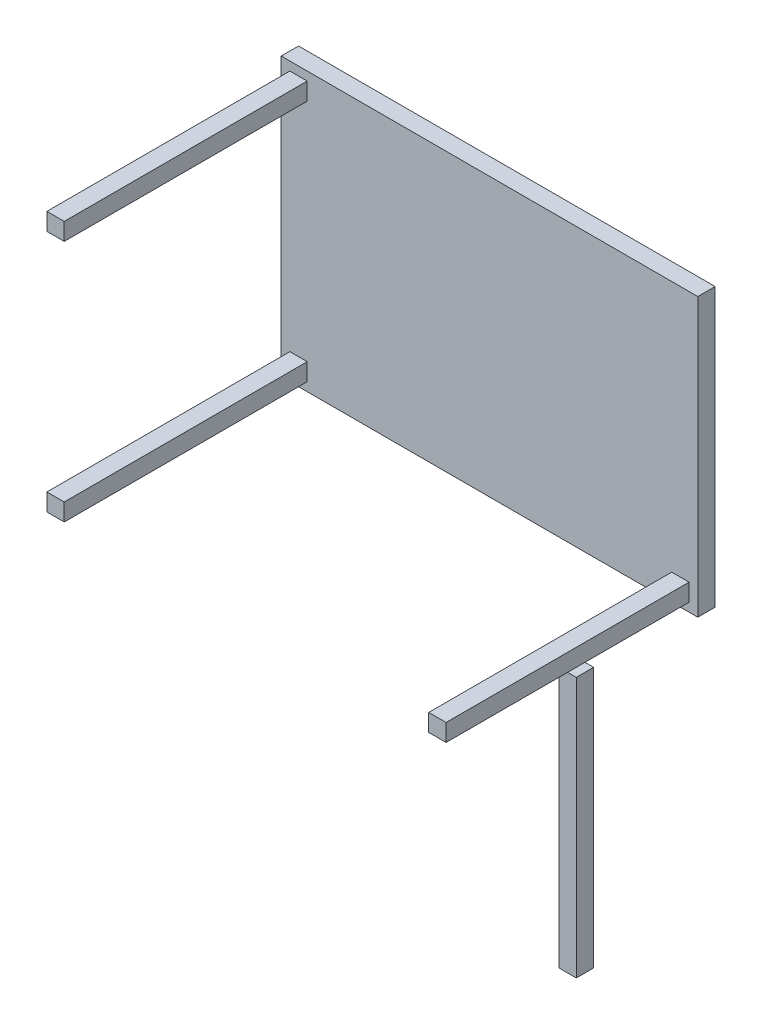
ISO-10303-21;
HEADER;
FILE_DESCRIPTION(('STEP AP214'),'2;1');
FILE_NAME('part.step','',(''),(''),'','','');
FILE_SCHEMA(('AUTOMOTIVE_DESIGN { 1 0 10303 214 1 1 1 1 }'));
ENDSEC;
DATA;
#1=APPLICATION_CONTEXT('core data for automotive mechanical design processes');
#2=APPLICATION_PROTOCOL_DEFINITION('international standard','automotive_design',2000,#1);
#3=PRODUCT_CONTEXT('',#1,'mechanical');
#4=PRODUCT('Part','Part','',(#3));
#5=PRODUCT_RELATED_PRODUCT_CATEGORY('part','',(#4));
#6=PRODUCT_DEFINITION_FORMATION('','',#4);
#7=PRODUCT_DEFINITION_CONTEXT('part definition',#1,'design');
#8=PRODUCT_DEFINITION('design','',#6,#7);
#9=PRODUCT_DEFINITION_SHAPE('','',#8);
#10=(LENGTH_UNIT() NAMED_UNIT(*) SI_UNIT(.MILLI.,.METRE.));
#11=(NAMED_UNIT(*) PLANE_ANGLE_UNIT() SI_UNIT($,.RADIAN.));
#12=(NAMED_UNIT(*) SI_UNIT($,.STERADIAN.) SOLID_ANGLE_UNIT());
#13=UNCERTAINTY_MEASURE_WITH_UNIT(LENGTH_MEASURE(1.E-05),#10,'distance_accuracy_value','');
#14=(GEOMETRIC_REPRESENTATION_CONTEXT(3) GLOBAL_UNCERTAINTY_ASSIGNED_CONTEXT((#13)) GLOBAL_UNIT_ASSIGNED_CONTEXT((#10,
#11,#12)) REPRESENTATION_CONTEXT('',''));
#15=CARTESIAN_POINT('',(0.,0.,0.));
#16=DIRECTION('',(0.,0.,1.));
#17=DIRECTION('',(1.,0.,0.));
#18=AXIS2_PLACEMENT_3D('',#15,#16,#17);
#19=CARTESIAN_POINT('',(575.,-1150.,325.));
#20=DIRECTION('',(-1.,0.,0.));
#21=DIRECTION('',(0.,0.,1.));
#22=AXIS2_PLACEMENT_3D('',#19,#20,#21);
#23=PLANE('',#22);
#24=DIRECTION('',(0.,0.,1.));
#25=VECTOR('',#24,1.);
#26=CARTESIAN_POINT('',(575.,-400.,325.));
#27=LINE('',#26,#25);
#28=CARTESIAN_POINT('',(575.,-400.,325.));
#29=VERTEX_POINT('',#28);
#30=CARTESIAN_POINT('',(575.,-400.,375.));
#31=VERTEX_POINT('',#30);
#32=EDGE_CURVE('E114',#29,#31,#27,.T.);
#33=ORIENTED_EDGE('',*,*,#32,.T.);
#34=DIRECTION('',(0.,1.,0.));
#35=VECTOR('',#34,1.);
#36=CARTESIAN_POINT('',(575.,-1150.,375.));
#37=LINE('',#36,#35);
#38=CARTESIAN_POINT('',(575.,-1150.,375.));
#39=VERTEX_POINT('',#38);
#40=EDGE_CURVE('E12',#39,#31,#37,.T.);
#41=ORIENTED_EDGE('',*,*,#40,.F.);
#42=DIRECTION('',(0.,0.,1.));
#43=VECTOR('',#42,1.);
#44=CARTESIAN_POINT('',(575.,-1150.,325.));
#45=LINE('',#44,#43);
#46=CARTESIAN_POINT('',(575.,-1150.,325.));
#47=VERTEX_POINT('',#46);
#48=EDGE_CURVE('E102',#47,#39,#45,.T.);
#49=ORIENTED_EDGE('',*,*,#48,.F.);
#50=DIRECTION('',(0.,1.,0.));
#51=VECTOR('',#50,1.);
#52=CARTESIAN_POINT('',(575.,-1150.,325.));
#53=LINE('',#52,#51);
#54=EDGE_CURVE('E110',#47,#29,#53,.T.);
#55=ORIENTED_EDGE('',*,*,#54,.T.);
#56=EDGE_LOOP('',(#33,#41,#49,#55));
#57=FACE_BOUND('',#56,.T.);
#58=ADVANCED_FACE('F51',(#57),#23,.F.);
#59=CARTESIAN_POINT('',(525.,-1150.,375.));
#60=DIRECTION('',(0.,0.,-1.));
#61=DIRECTION('',(-1.,0.,0.));
#62=AXIS2_PLACEMENT_3D('',#59,#60,#61);
#63=PLANE('',#62);
#64=DIRECTION('',(-1.,0.,0.));
#65=VECTOR('',#64,1.);
#66=CARTESIAN_POINT('',(525.,-400.,375.));
#67=LINE('',#66,#65);
#68=CARTESIAN_POINT('',(525.,-400.,375.));
#69=VERTEX_POINT('',#68);
#70=EDGE_CURVE('E106',#31,#69,#67,.T.);
#71=ORIENTED_EDGE('',*,*,#70,.T.);
#72=DIRECTION('',(0.,1.,0.));
#73=VECTOR('',#72,1.);
#74=CARTESIAN_POINT('',(525.,-1150.,375.));
#75=LINE('',#74,#73);
#76=CARTESIAN_POINT('',(525.,-1150.,375.));
#77=VERTEX_POINT('',#76);
#78=EDGE_CURVE('E59',#77,#69,#75,.T.);
#79=ORIENTED_EDGE('',*,*,#78,.F.);
#80=DIRECTION('',(-1.,0.,0.));
#81=VECTOR('',#80,1.);
#82=CARTESIAN_POINT('',(525.,-1150.,375.));
#83=LINE('',#82,#81);
#84=EDGE_CURVE('E97',#39,#77,#83,.T.);
#85=ORIENTED_EDGE('',*,*,#84,.F.);
#86=ORIENTED_EDGE('',*,*,#40,.T.);
#87=EDGE_LOOP('',(#71,#79,#85,#86));
#88=FACE_BOUND('',#87,.T.);
#89=ADVANCED_FACE('F105',(#88),#63,.F.);
#90=CARTESIAN_POINT('',(525.,-1150.,325.));
#91=DIRECTION('',(1.,0.,0.));
#92=DIRECTION('',(0.,0.,-1.));
#93=AXIS2_PLACEMENT_3D('',#90,#91,#92);
#94=PLANE('',#93);
#95=DIRECTION('',(0.,0.,-1.));
#96=VECTOR('',#95,1.);
#97=CARTESIAN_POINT('',(525.,-400.,325.));
#98=LINE('',#97,#96);
#99=CARTESIAN_POINT('',(525.,-400.,325.));
#100=VERTEX_POINT('',#99);
#101=EDGE_CURVE('E84',#69,#100,#98,.T.);
#102=ORIENTED_EDGE('',*,*,#101,.T.);
#103=DIRECTION('',(0.,1.,0.));
#104=VECTOR('',#103,1.);
#105=CARTESIAN_POINT('',(525.,-1150.,325.));
#106=LINE('',#105,#104);
#107=CARTESIAN_POINT('',(525.,-1150.,325.));
#108=VERTEX_POINT('',#107);
#109=EDGE_CURVE('E107',#108,#100,#106,.T.);
#110=ORIENTED_EDGE('',*,*,#109,.F.);
#111=DIRECTION('',(0.,0.,-1.));
#112=VECTOR('',#111,1.);
#113=CARTESIAN_POINT('',(525.,-1150.,325.));
#114=LINE('',#113,#112);
#115=EDGE_CURVE('E100',#77,#108,#114,.T.);
#116=ORIENTED_EDGE('',*,*,#115,.F.);
#117=ORIENTED_EDGE('',*,*,#78,.T.);
#118=EDGE_LOOP('',(#102,#110,#116,#117));
#119=FACE_BOUND('',#118,.T.);
#120=ADVANCED_FACE('F108',(#119),#94,.F.);
#121=CARTESIAN_POINT('',(525.,-1150.,325.));
#122=DIRECTION('',(0.,0.,1.));
#123=DIRECTION('',(1.,0.,0.));
#124=AXIS2_PLACEMENT_3D('',#121,#122,#123);
#125=PLANE('',#124);
#126=DIRECTION('',(1.,0.,0.));
#127=VECTOR('',#126,1.);
#128=CARTESIAN_POINT('',(525.,-400.,325.));
#129=LINE('',#128,#127);
#130=EDGE_CURVE('E90',#100,#29,#129,.T.);
#131=ORIENTED_EDGE('',*,*,#130,.T.);
#132=ORIENTED_EDGE('',*,*,#54,.F.);
#133=DIRECTION('',(1.,0.,0.));
#134=VECTOR('',#133,1.);
#135=CARTESIAN_POINT('',(525.,-1150.,325.));
#136=LINE('',#135,#134);
#137=EDGE_CURVE('E67',#108,#47,#136,.T.);
#138=ORIENTED_EDGE('',*,*,#137,.F.);
#139=ORIENTED_EDGE('',*,*,#109,.T.);
#140=EDGE_LOOP('',(#131,#132,#138,#139));
#141=FACE_BOUND('',#140,.T.);
#142=ADVANCED_FACE('F121',(#141),#125,.F.);
#143=CARTESIAN_POINT('',(0.,-1150.,0.));
#144=DIRECTION('',(0.,1.,0.));
#145=DIRECTION('',(0.,0.,1.));
#146=AXIS2_PLACEMENT_3D('',#143,#144,#145);
#147=PLANE('',#146);
#148=ORIENTED_EDGE('',*,*,#48,.T.);
#149=ORIENTED_EDGE('',*,*,#84,.T.);
#150=ORIENTED_EDGE('',*,*,#115,.T.);
#151=ORIENTED_EDGE('',*,*,#137,.T.);
#152=EDGE_LOOP('',(#148,#149,#150,#151));
#153=FACE_BOUND('',#152,.T.);
#154=ADVANCED_FACE('F98',(#153),#147,.F.);
#155=CARTESIAN_POINT('',(0.,-400.,0.));
#156=DIRECTION('',(0.,1.,0.));
#157=DIRECTION('',(0.,0.,1.));
#158=AXIS2_PLACEMENT_3D('',#155,#156,#157);
#159=PLANE('',#158);
#160=ORIENTED_EDGE('',*,*,#32,.F.);
#161=ORIENTED_EDGE('',*,*,#130,.F.);
#162=ORIENTED_EDGE('',*,*,#101,.F.);
#163=ORIENTED_EDGE('',*,*,#70,.F.);
#164=EDGE_LOOP('',(#160,#161,#162,#163));
#165=FACE_BOUND('',#164,.T.);
#166=ADVANCED_FACE('F124',(#165),#159,.T.);
#167=CLOSED_SHELL('',(#58,#89,#120,#142,#154,#166));
#168=MANIFOLD_SOLID_BREP('B2',#167);
#169=CARTESIAN_POINT('',(0.,0.,50.));
#170=DIRECTION('',(0.,0.,-1.));
#171=DIRECTION('',(-1.,0.,0.));
#172=AXIS2_PLACEMENT_3D('',#169,#170,#171);
#173=PLANE('',#172);
#174=DIRECTION('',(0.,1.,0.));
#175=VECTOR('',#174,1.);
#176=CARTESIAN_POINT('',(575.,0.,50.));
#177=LINE('',#176,#175);
#178=CARTESIAN_POINT('',(575.,-375.,50.));
#179=VERTEX_POINT('',#178);
#180=CARTESIAN_POINT('',(575.,-325.,50.));
#181=VERTEX_POINT('',#180);
#182=EDGE_CURVE('E349',#179,#181,#177,.T.);
#183=ORIENTED_EDGE('',*,*,#182,.F.);
#184=DIRECTION('',(1.,0.,0.));
#185=VECTOR('',#184,1.);
#186=CARTESIAN_POINT('',(0.,-375.,50.));
#187=LINE('',#186,#185);
#188=CARTESIAN_POINT('',(525.,-375.,50.));
#189=VERTEX_POINT('',#188);
#190=EDGE_CURVE('E340',#189,#179,#187,.T.);
#191=ORIENTED_EDGE('',*,*,#190,.F.);
#192=DIRECTION('',(0.,-1.,0.));
#193=VECTOR('',#192,1.);
#194=CARTESIAN_POINT('',(525.,0.,50.));
#195=LINE('',#194,#193);
#196=CARTESIAN_POINT('',(525.,-325.,50.));
#197=VERTEX_POINT('',#196);
#198=EDGE_CURVE('E343',#197,#189,#195,.T.);
#199=ORIENTED_EDGE('',*,*,#198,.F.);
#200=DIRECTION('',(-1.,0.,0.));
#201=VECTOR('',#200,1.);
#202=CARTESIAN_POINT('',(0.,-325.,50.));
#203=LINE('',#202,#201);
#204=EDGE_CURVE('E346',#181,#197,#203,.T.);
#205=ORIENTED_EDGE('',*,*,#204,.F.);
#206=EDGE_LOOP('',(#183,#191,#199,#205));
#207=FACE_BOUND('',#206,.T.);
#208=DIRECTION('',(0.,1.,0.));
#209=VECTOR('',#208,1.);
#210=CARTESIAN_POINT('',(600.,-400.,50.));
#211=LINE('',#210,#209);
#212=CARTESIAN_POINT('',(600.,-400.,50.));
#213=VERTEX_POINT('',#212);
#214=CARTESIAN_POINT('',(600.,400.,50.));
#215=VERTEX_POINT('',#214);
#216=EDGE_CURVE('E386',#213,#215,#211,.T.);
#217=ORIENTED_EDGE('',*,*,#216,.T.);
#218=DIRECTION('',(-1.,0.,0.));
#219=VECTOR('',#218,1.);
#220=CARTESIAN_POINT('',(-600.,400.,50.));
#221=LINE('',#220,#219);
#222=CARTESIAN_POINT('',(-600.,400.,50.));
#223=VERTEX_POINT('',#222);
#224=EDGE_CURVE('E389',#215,#223,#221,.T.);
#225=ORIENTED_EDGE('',*,*,#224,.T.);
#226=DIRECTION('',(0.,-1.,0.));
#227=VECTOR('',#226,1.);
#228=CARTESIAN_POINT('',(-600.,-400.,50.));
#229=LINE('',#228,#227);
#230=CARTESIAN_POINT('',(-600.,-400.,50.));
#231=VERTEX_POINT('',#230);
#232=EDGE_CURVE('E392',#223,#231,#229,.T.);
#233=ORIENTED_EDGE('',*,*,#232,.T.);
#234=DIRECTION('',(1.,0.,0.));
#235=VECTOR('',#234,1.);
#236=CARTESIAN_POINT('',(-600.,-400.,50.));
#237=LINE('',#236,#235);
#238=EDGE_CURVE('E394',#231,#213,#237,.T.);
#239=ORIENTED_EDGE('',*,*,#238,.T.);
#240=EDGE_LOOP('',(#217,#225,#233,#239));
#241=FACE_BOUND('',#240,.T.);
#242=DIRECTION('',(0.,1.,0.));
#243=VECTOR('',#242,1.);
#244=CARTESIAN_POINT('',(-525.,0.,50.));
#245=LINE('',#244,#243);
#246=CARTESIAN_POINT('',(-525.,325.,50.));
#247=VERTEX_POINT('',#246);
#248=CARTESIAN_POINT('',(-525.,375.,50.));
#249=VERTEX_POINT('',#248);
#250=EDGE_CURVE('E382',#247,#249,#245,.T.);
#251=ORIENTED_EDGE('',*,*,#250,.F.);
#252=DIRECTION('',(1.,0.,0.));
#253=VECTOR('',#252,1.);
#254=CARTESIAN_POINT('',(0.,325.,50.));
#255=LINE('',#254,#253);
#256=CARTESIAN_POINT('',(-575.,325.,50.));
#257=VERTEX_POINT('',#256);
#258=EDGE_CURVE('E373',#257,#247,#255,.T.);
#259=ORIENTED_EDGE('',*,*,#258,.F.);
#260=DIRECTION('',(0.,-1.,0.));
#261=VECTOR('',#260,1.);
#262=CARTESIAN_POINT('',(-575.,0.,50.));
#263=LINE('',#262,#261);
#264=CARTESIAN_POINT('',(-575.,375.,50.));
#265=VERTEX_POINT('',#264);
#266=EDGE_CURVE('E376',#265,#257,#263,.T.);
#267=ORIENTED_EDGE('',*,*,#266,.F.);
#268=DIRECTION('',(-1.,0.,0.));
#269=VECTOR('',#268,1.);
#270=CARTESIAN_POINT('',(0.,375.,50.));
#271=LINE('',#270,#269);
#272=EDGE_CURVE('E379',#249,#265,#271,.T.);
#273=ORIENTED_EDGE('',*,*,#272,.F.);
#274=EDGE_LOOP('',(#251,#259,#267,#273));
#275=FACE_BOUND('',#274,.T.);
#276=DIRECTION('',(0.,1.,0.));
#277=VECTOR('',#276,1.);
#278=CARTESIAN_POINT('',(-525.,0.,50.));
#279=LINE('',#278,#277);
#280=CARTESIAN_POINT('',(-525.,-375.,50.));
#281=VERTEX_POINT('',#280);
#282=CARTESIAN_POINT('',(-525.,-325.,50.));
#283=VERTEX_POINT('',#282);
#284=EDGE_CURVE('E307',#281,#283,#279,.T.);
#285=ORIENTED_EDGE('',*,*,#284,.F.);
#286=DIRECTION('',(1.,0.,0.));
#287=VECTOR('',#286,1.);
#288=CARTESIAN_POINT('',(0.,-375.,50.));
#289=LINE('',#288,#287);
#290=CARTESIAN_POINT('',(-575.,-375.,50.));
#291=VERTEX_POINT('',#290);
#292=EDGE_CURVE('E308',#291,#281,#289,.T.);
#293=ORIENTED_EDGE('',*,*,#292,.F.);
#294=DIRECTION('',(0.,-1.,0.));
#295=VECTOR('',#294,1.);
#296=CARTESIAN_POINT('',(-575.,0.,50.));
#297=LINE('',#296,#295);
#298=CARTESIAN_POINT('',(-575.,-325.,50.));
#299=VERTEX_POINT('',#298);
#300=EDGE_CURVE('E195',#299,#291,#297,.T.);
#301=ORIENTED_EDGE('',*,*,#300,.F.);
#302=DIRECTION('',(-1.,0.,0.));
#303=VECTOR('',#302,1.);
#304=CARTESIAN_POINT('',(0.,-325.,50.));
#305=LINE('',#304,#303);
#306=EDGE_CURVE('E190',#283,#299,#305,.T.);
#307=ORIENTED_EDGE('',*,*,#306,.F.);
#308=EDGE_LOOP('',(#285,#293,#301,#307));
#309=FACE_BOUND('',#308,.T.);
#310=ADVANCED_FACE('F175',(#207,#241,#275,#309),#173,.F.);
#311=CARTESIAN_POINT('',(600.,-400.,50.));
#312=DIRECTION('',(-1.,0.,0.));
#313=DIRECTION('',(0.,0.,1.));
#314=AXIS2_PLACEMENT_3D('',#311,#312,#313);
#315=PLANE('',#314);
#316=DIRECTION('',(0.,1.,0.));
#317=VECTOR('',#316,1.);
#318=CARTESIAN_POINT('',(600.,-400.,0.));
#319=LINE('',#318,#317);
#320=CARTESIAN_POINT('',(600.,-400.,0.));
#321=VERTEX_POINT('',#320);
#322=CARTESIAN_POINT('',(600.,400.,0.));
#323=VERTEX_POINT('',#322);
#324=EDGE_CURVE('E385',#321,#323,#319,.T.);
#325=ORIENTED_EDGE('',*,*,#324,.T.);
#326=DIRECTION('',(0.,0.,-1.));
#327=VECTOR('',#326,1.);
#328=CARTESIAN_POINT('',(600.,400.,50.));
#329=LINE('',#328,#327);
#330=EDGE_CURVE('E49',#215,#323,#329,.T.);
#331=ORIENTED_EDGE('',*,*,#330,.F.);
#332=ORIENTED_EDGE('',*,*,#216,.F.);
#333=DIRECTION('',(0.,0.,-1.));
#334=VECTOR('',#333,1.);
#335=CARTESIAN_POINT('',(600.,-400.,50.));
#336=LINE('',#335,#334);
#337=EDGE_CURVE('E396',#213,#321,#336,.T.);
#338=ORIENTED_EDGE('',*,*,#337,.T.);
#339=EDGE_LOOP('',(#325,#331,#332,#338));
#340=FACE_BOUND('',#339,.T.);
#341=ADVANCED_FACE('F177',(#340),#315,.F.);
#342=CARTESIAN_POINT('',(-600.,400.,50.));
#343=DIRECTION('',(0.,-1.,0.));
#344=DIRECTION('',(0.,0.,-1.));
#345=AXIS2_PLACEMENT_3D('',#342,#343,#344);
#346=PLANE('',#345);
#347=DIRECTION('',(-1.,0.,0.));
#348=VECTOR('',#347,1.);
#349=CARTESIAN_POINT('',(-600.,400.,0.));
#350=LINE('',#349,#348);
#351=CARTESIAN_POINT('',(-600.,400.,0.));
#352=VERTEX_POINT('',#351);
#353=EDGE_CURVE('E399',#323,#352,#350,.T.);
#354=ORIENTED_EDGE('',*,*,#353,.T.);
#355=DIRECTION('',(0.,0.,-1.));
#356=VECTOR('',#355,1.);
#357=CARTESIAN_POINT('',(-600.,400.,50.));
#358=LINE('',#357,#356);
#359=EDGE_CURVE('E183',#223,#352,#358,.T.);
#360=ORIENTED_EDGE('',*,*,#359,.F.);
#361=ORIENTED_EDGE('',*,*,#224,.F.);
#362=ORIENTED_EDGE('',*,*,#330,.T.);
#363=EDGE_LOOP('',(#354,#360,#361,#362));
#364=FACE_BOUND('',#363,.T.);
#365=ADVANCED_FACE('F429',(#364),#346,.F.);
#366=CARTESIAN_POINT('',(-600.,-400.,50.));
#367=DIRECTION('',(1.,0.,0.));
#368=DIRECTION('',(0.,0.,-1.));
#369=AXIS2_PLACEMENT_3D('',#366,#367,#368);
#370=PLANE('',#369);
#371=DIRECTION('',(0.,-1.,0.));
#372=VECTOR('',#371,1.);
#373=CARTESIAN_POINT('',(-600.,-400.,0.));
#374=LINE('',#373,#372);
#375=CARTESIAN_POINT('',(-600.,-400.,0.));
#376=VERTEX_POINT('',#375);
#377=EDGE_CURVE('E401',#352,#376,#374,.T.);
#378=ORIENTED_EDGE('',*,*,#377,.T.);
#379=DIRECTION('',(0.,0.,-1.));
#380=VECTOR('',#379,1.);
#381=CARTESIAN_POINT('',(-600.,-400.,50.));
#382=LINE('',#381,#380);
#383=EDGE_CURVE('E406',#231,#376,#382,.T.);
#384=ORIENTED_EDGE('',*,*,#383,.F.);
#385=ORIENTED_EDGE('',*,*,#232,.F.);
#386=ORIENTED_EDGE('',*,*,#359,.T.);
#387=EDGE_LOOP('',(#378,#384,#385,#386));
#388=FACE_BOUND('',#387,.T.);
#389=ADVANCED_FACE('F413',(#388),#370,.F.);
#390=CARTESIAN_POINT('',(-600.,-400.,50.));
#391=DIRECTION('',(0.,1.,0.));
#392=DIRECTION('',(0.,0.,1.));
#393=AXIS2_PLACEMENT_3D('',#390,#391,#392);
#394=PLANE('',#393);
#395=DIRECTION('',(1.,0.,0.));
#396=VECTOR('',#395,1.);
#397=CARTESIAN_POINT('',(-600.,-400.,0.));
#398=LINE('',#397,#396);
#399=EDGE_CURVE('E390',#376,#321,#398,.T.);
#400=ORIENTED_EDGE('',*,*,#399,.T.);
#401=ORIENTED_EDGE('',*,*,#337,.F.);
#402=ORIENTED_EDGE('',*,*,#238,.F.);
#403=ORIENTED_EDGE('',*,*,#383,.T.);
#404=EDGE_LOOP('',(#400,#401,#402,#403));
#405=FACE_BOUND('',#404,.T.);
#406=ADVANCED_FACE('F422',(#405),#394,.F.);
#407=CARTESIAN_POINT('',(0.,0.,0.));
#408=DIRECTION('',(0.,0.,-1.));
#409=DIRECTION('',(-1.,0.,0.));
#410=AXIS2_PLACEMENT_3D('',#407,#408,#409);
#411=PLANE('',#410);
#412=ORIENTED_EDGE('',*,*,#324,.F.);
#413=ORIENTED_EDGE('',*,*,#399,.F.);
#414=ORIENTED_EDGE('',*,*,#377,.F.);
#415=ORIENTED_EDGE('',*,*,#353,.F.);
#416=EDGE_LOOP('',(#412,#413,#414,#415));
#417=FACE_BOUND('',#416,.T.);
#418=ADVANCED_FACE('F419',(#417),#411,.T.);
#419=CARTESIAN_POINT('',(-525.,325.,750.));
#420=DIRECTION('',(-1.,0.,0.));
#421=DIRECTION('',(0.,0.,1.));
#422=AXIS2_PLACEMENT_3D('',#419,#420,#421);
#423=PLANE('',#422);
#424=DIRECTION('',(0.,0.,-1.));
#425=VECTOR('',#424,1.);
#426=CARTESIAN_POINT('',(-525.,325.,750.));
#427=LINE('',#426,#425);
#428=CARTESIAN_POINT('',(-525.,325.,750.));
#429=VERTEX_POINT('',#428);
#430=EDGE_CURVE('E361',#429,#247,#427,.T.);
#431=ORIENTED_EDGE('',*,*,#430,.T.);
#432=ORIENTED_EDGE('',*,*,#250,.T.);
#433=DIRECTION('',(0.,0.,-1.));
#434=VECTOR('',#433,1.);
#435=CARTESIAN_POINT('',(-525.,375.,750.));
#436=LINE('',#435,#434);
#437=CARTESIAN_POINT('',(-525.,375.,750.));
#438=VERTEX_POINT('',#437);
#439=EDGE_CURVE('E370',#438,#249,#436,.T.);
#440=ORIENTED_EDGE('',*,*,#439,.F.);
#441=DIRECTION('',(0.,1.,0.));
#442=VECTOR('',#441,1.);
#443=CARTESIAN_POINT('',(-525.,325.,750.));
#444=LINE('',#443,#442);
#445=EDGE_CURVE('E352',#429,#438,#444,.T.);
#446=ORIENTED_EDGE('',*,*,#445,.F.);
#447=EDGE_LOOP('',(#431,#432,#440,#446));
#448=FACE_BOUND('',#447,.T.);
#449=ADVANCED_FACE('F445',(#448),#423,.F.);
#450=CARTESIAN_POINT('',(-575.,375.,750.));
#451=DIRECTION('',(0.,-1.,0.));
#452=DIRECTION('',(0.,0.,-1.));
#453=AXIS2_PLACEMENT_3D('',#450,#451,#452);
#454=PLANE('',#453);
#455=ORIENTED_EDGE('',*,*,#439,.T.);
#456=ORIENTED_EDGE('',*,*,#272,.T.);
#457=DIRECTION('',(0.,0.,-1.));
#458=VECTOR('',#457,1.);
#459=CARTESIAN_POINT('',(-575.,375.,750.));
#460=LINE('',#459,#458);
#461=CARTESIAN_POINT('',(-575.,375.,750.));
#462=VERTEX_POINT('',#461);
#463=EDGE_CURVE('E367',#462,#265,#460,.T.);
#464=ORIENTED_EDGE('',*,*,#463,.F.);
#465=DIRECTION('',(-1.,0.,0.));
#466=VECTOR('',#465,1.);
#467=CARTESIAN_POINT('',(-575.,375.,750.));
#468=LINE('',#467,#466);
#469=EDGE_CURVE('E355',#438,#462,#468,.T.);
#470=ORIENTED_EDGE('',*,*,#469,.F.);
#471=EDGE_LOOP('',(#455,#456,#464,#470));
#472=FACE_BOUND('',#471,.T.);
#473=ADVANCED_FACE('F461',(#472),#454,.F.);
#474=CARTESIAN_POINT('',(-575.,325.,750.));
#475=DIRECTION('',(1.,0.,0.));
#476=DIRECTION('',(0.,0.,-1.));
#477=AXIS2_PLACEMENT_3D('',#474,#475,#476);
#478=PLANE('',#477);
#479=ORIENTED_EDGE('',*,*,#463,.T.);
#480=ORIENTED_EDGE('',*,*,#266,.T.);
#481=DIRECTION('',(0.,0.,-1.));
#482=VECTOR('',#481,1.);
#483=CARTESIAN_POINT('',(-575.,325.,750.));
#484=LINE('',#483,#482);
#485=CARTESIAN_POINT('',(-575.,325.,750.));
#486=VERTEX_POINT('',#485);
#487=EDGE_CURVE('E364',#486,#257,#484,.T.);
#488=ORIENTED_EDGE('',*,*,#487,.F.);
#489=DIRECTION('',(0.,-1.,0.));
#490=VECTOR('',#489,1.);
#491=CARTESIAN_POINT('',(-575.,325.,750.));
#492=LINE('',#491,#490);
#493=EDGE_CURVE('E357',#462,#486,#492,.T.);
#494=ORIENTED_EDGE('',*,*,#493,.F.);
#495=EDGE_LOOP('',(#479,#480,#488,#494));
#496=FACE_BOUND('',#495,.T.);
#497=ADVANCED_FACE('F469',(#496),#478,.F.);
#498=CARTESIAN_POINT('',(-575.,325.,750.));
#499=DIRECTION('',(0.,1.,0.));
#500=DIRECTION('',(0.,0.,1.));
#501=AXIS2_PLACEMENT_3D('',#498,#499,#500);
#502=PLANE('',#501);
#503=ORIENTED_EDGE('',*,*,#487,.T.);
#504=ORIENTED_EDGE('',*,*,#258,.T.);
#505=ORIENTED_EDGE('',*,*,#430,.F.);
#506=DIRECTION('',(1.,0.,0.));
#507=VECTOR('',#506,1.);
#508=CARTESIAN_POINT('',(-575.,325.,750.));
#509=LINE('',#508,#507);
#510=EDGE_CURVE('E359',#486,#429,#509,.T.);
#511=ORIENTED_EDGE('',*,*,#510,.F.);
#512=EDGE_LOOP('',(#503,#504,#505,#511));
#513=FACE_BOUND('',#512,.T.);
#514=ADVANCED_FACE('F477',(#513),#502,.F.);
#515=CARTESIAN_POINT('',(0.,0.,750.));
#516=DIRECTION('',(0.,0.,-1.));
#517=DIRECTION('',(-1.,0.,0.));
#518=AXIS2_PLACEMENT_3D('',#515,#516,#517);
#519=PLANE('',#518);
#520=ORIENTED_EDGE('',*,*,#445,.T.);
#521=ORIENTED_EDGE('',*,*,#469,.T.);
#522=ORIENTED_EDGE('',*,*,#493,.T.);
#523=ORIENTED_EDGE('',*,*,#510,.T.);
#524=EDGE_LOOP('',(#520,#521,#522,#523));
#525=FACE_BOUND('',#524,.T.);
#526=ADVANCED_FACE('F486',(#525),#519,.F.);
#527=CARTESIAN_POINT('',(575.,-375.,750.));
#528=DIRECTION('',(-1.,0.,0.));
#529=DIRECTION('',(0.,0.,1.));
#530=AXIS2_PLACEMENT_3D('',#527,#528,#529);
#531=PLANE('',#530);
#532=DIRECTION('',(0.,0.,-1.));
#533=VECTOR('',#532,1.);
#534=CARTESIAN_POINT('',(575.,-375.,750.));
#535=LINE('',#534,#533);
#536=CARTESIAN_POINT('',(575.,-375.,750.));
#537=VERTEX_POINT('',#536);
#538=EDGE_CURVE('E328',#537,#179,#535,.T.);
#539=ORIENTED_EDGE('',*,*,#538,.T.);
#540=ORIENTED_EDGE('',*,*,#182,.T.);
#541=DIRECTION('',(0.,0.,-1.));
#542=VECTOR('',#541,1.);
#543=CARTESIAN_POINT('',(575.,-325.,750.));
#544=LINE('',#543,#542);
#545=CARTESIAN_POINT('',(575.,-325.,750.));
#546=VERTEX_POINT('',#545);
#547=EDGE_CURVE('E337',#546,#181,#544,.T.);
#548=ORIENTED_EDGE('',*,*,#547,.F.);
#549=DIRECTION('',(0.,1.,0.));
#550=VECTOR('',#549,1.);
#551=CARTESIAN_POINT('',(575.,-375.,750.));
#552=LINE('',#551,#550);
#553=EDGE_CURVE('E319',#537,#546,#552,.T.);
#554=ORIENTED_EDGE('',*,*,#553,.F.);
#555=EDGE_LOOP('',(#539,#540,#548,#554));
#556=FACE_BOUND('',#555,.T.);
#557=ADVANCED_FACE('F495',(#556),#531,.F.);
#558=CARTESIAN_POINT('',(525.,-325.,750.));
#559=DIRECTION('',(0.,-1.,0.));
#560=DIRECTION('',(0.,0.,-1.));
#561=AXIS2_PLACEMENT_3D('',#558,#559,#560);
#562=PLANE('',#561);
#563=ORIENTED_EDGE('',*,*,#547,.T.);
#564=ORIENTED_EDGE('',*,*,#204,.T.);
#565=DIRECTION('',(0.,0.,-1.));
#566=VECTOR('',#565,1.);
#567=CARTESIAN_POINT('',(525.,-325.,750.));
#568=LINE('',#567,#566);
#569=CARTESIAN_POINT('',(525.,-325.,750.));
#570=VERTEX_POINT('',#569);
#571=EDGE_CURVE('E334',#570,#197,#568,.T.);
#572=ORIENTED_EDGE('',*,*,#571,.F.);
#573=DIRECTION('',(-1.,0.,0.));
#574=VECTOR('',#573,1.);
#575=CARTESIAN_POINT('',(525.,-325.,750.));
#576=LINE('',#575,#574);
#577=EDGE_CURVE('E322',#546,#570,#576,.T.);
#578=ORIENTED_EDGE('',*,*,#577,.F.);
#579=EDGE_LOOP('',(#563,#564,#572,#578));
#580=FACE_BOUND('',#579,.T.);
#581=ADVANCED_FACE('F504',(#580),#562,.F.);
#582=CARTESIAN_POINT('',(525.,-375.,750.));
#583=DIRECTION('',(1.,0.,0.));
#584=DIRECTION('',(0.,0.,-1.));
#585=AXIS2_PLACEMENT_3D('',#582,#583,#584);
#586=PLANE('',#585);
#587=ORIENTED_EDGE('',*,*,#571,.T.);
#588=ORIENTED_EDGE('',*,*,#198,.T.);
#589=DIRECTION('',(0.,0.,-1.));
#590=VECTOR('',#589,1.);
#591=CARTESIAN_POINT('',(525.,-375.,750.));
#592=LINE('',#591,#590);
#593=CARTESIAN_POINT('',(525.,-375.,750.));
#594=VERTEX_POINT('',#593);
#595=EDGE_CURVE('E331',#594,#189,#592,.T.);
#596=ORIENTED_EDGE('',*,*,#595,.F.);
#597=DIRECTION('',(0.,-1.,0.));
#598=VECTOR('',#597,1.);
#599=CARTESIAN_POINT('',(525.,-375.,750.));
#600=LINE('',#599,#598);
#601=EDGE_CURVE('E324',#570,#594,#600,.T.);
#602=ORIENTED_EDGE('',*,*,#601,.F.);
#603=EDGE_LOOP('',(#587,#588,#596,#602));
#604=FACE_BOUND('',#603,.T.);
#605=ADVANCED_FACE('F513',(#604),#586,.F.);
#606=CARTESIAN_POINT('',(525.,-375.,750.));
#607=DIRECTION('',(0.,1.,0.));
#608=DIRECTION('',(0.,0.,1.));
#609=AXIS2_PLACEMENT_3D('',#606,#607,#608);
#610=PLANE('',#609);
#611=ORIENTED_EDGE('',*,*,#595,.T.);
#612=ORIENTED_EDGE('',*,*,#190,.T.);
#613=ORIENTED_EDGE('',*,*,#538,.F.);
#614=DIRECTION('',(1.,0.,0.));
#615=VECTOR('',#614,1.);
#616=CARTESIAN_POINT('',(525.,-375.,750.));
#617=LINE('',#616,#615);
#618=EDGE_CURVE('E326',#594,#537,#617,.T.);
#619=ORIENTED_EDGE('',*,*,#618,.F.);
#620=EDGE_LOOP('',(#611,#612,#613,#619));
#621=FACE_BOUND('',#620,.T.);
#622=ADVANCED_FACE('F522',(#621),#610,.F.);
#623=CARTESIAN_POINT('',(0.,0.,750.));
#624=DIRECTION('',(0.,0.,-1.));
#625=DIRECTION('',(-1.,0.,0.));
#626=AXIS2_PLACEMENT_3D('',#623,#624,#625);
#627=PLANE('',#626);
#628=ORIENTED_EDGE('',*,*,#553,.T.);
#629=ORIENTED_EDGE('',*,*,#577,.T.);
#630=ORIENTED_EDGE('',*,*,#601,.T.);
#631=ORIENTED_EDGE('',*,*,#618,.T.);
#632=EDGE_LOOP('',(#628,#629,#630,#631));
#633=FACE_BOUND('',#632,.T.);
#634=ADVANCED_FACE('F530',(#633),#627,.F.);
#635=CARTESIAN_POINT('',(-525.,-375.,750.));
#636=DIRECTION('',(-1.,0.,0.));
#637=DIRECTION('',(0.,0.,1.));
#638=AXIS2_PLACEMENT_3D('',#635,#636,#637);
#639=PLANE('',#638);
#640=DIRECTION('',(0.,0.,-1.));
#641=VECTOR('',#640,1.);
#642=CARTESIAN_POINT('',(-525.,-375.,750.));
#643=LINE('',#642,#641);
#644=CARTESIAN_POINT('',(-525.,-375.,750.));
#645=VERTEX_POINT('',#644);
#646=EDGE_CURVE('E594',#645,#281,#643,.T.);
#647=ORIENTED_EDGE('',*,*,#646,.T.);
#648=ORIENTED_EDGE('',*,*,#284,.T.);
#649=DIRECTION('',(0.,0.,-1.));
#650=VECTOR('',#649,1.);
#651=CARTESIAN_POINT('',(-525.,-325.,750.));
#652=LINE('',#651,#650);
#653=CARTESIAN_POINT('',(-525.,-325.,750.));
#654=VERTEX_POINT('',#653);
#655=EDGE_CURVE('E290',#654,#283,#652,.T.);
#656=ORIENTED_EDGE('',*,*,#655,.F.);
#657=DIRECTION('',(0.,1.,0.));
#658=VECTOR('',#657,1.);
#659=CARTESIAN_POINT('',(-525.,-375.,750.));
#660=LINE('',#659,#658);
#661=EDGE_CURVE('E296',#645,#654,#660,.T.);
#662=ORIENTED_EDGE('',*,*,#661,.F.);
#663=EDGE_LOOP('',(#647,#648,#656,#662));
#664=FACE_BOUND('',#663,.T.);
#665=ADVANCED_FACE('F306',(#664),#639,.F.);
#666=CARTESIAN_POINT('',(-575.,-325.,750.));
#667=DIRECTION('',(0.,-1.,0.));
#668=DIRECTION('',(0.,0.,-1.));
#669=AXIS2_PLACEMENT_3D('',#666,#667,#668);
#670=PLANE('',#669);
#671=ORIENTED_EDGE('',*,*,#655,.T.);
#672=ORIENTED_EDGE('',*,*,#306,.T.);
#673=DIRECTION('',(0.,0.,-1.));
#674=VECTOR('',#673,1.);
#675=CARTESIAN_POINT('',(-575.,-325.,750.));
#676=LINE('',#675,#674);
#677=CARTESIAN_POINT('',(-575.,-325.,750.));
#678=VERTEX_POINT('',#677);
#679=EDGE_CURVE('E292',#678,#299,#676,.T.);
#680=ORIENTED_EDGE('',*,*,#679,.F.);
#681=DIRECTION('',(-1.,0.,0.));
#682=VECTOR('',#681,1.);
#683=CARTESIAN_POINT('',(-575.,-325.,750.));
#684=LINE('',#683,#682);
#685=EDGE_CURVE('E286',#654,#678,#684,.T.);
#686=ORIENTED_EDGE('',*,*,#685,.F.);
#687=EDGE_LOOP('',(#671,#672,#680,#686));
#688=FACE_BOUND('',#687,.T.);
#689=ADVANCED_FACE('F288',(#688),#670,.F.);
#690=CARTESIAN_POINT('',(-575.,-375.,750.));
#691=DIRECTION('',(1.,0.,0.));
#692=DIRECTION('',(0.,0.,-1.));
#693=AXIS2_PLACEMENT_3D('',#690,#691,#692);
#694=PLANE('',#693);
#695=ORIENTED_EDGE('',*,*,#679,.T.);
#696=ORIENTED_EDGE('',*,*,#300,.T.);
#697=DIRECTION('',(0.,0.,-1.));
#698=VECTOR('',#697,1.);
#699=CARTESIAN_POINT('',(-575.,-375.,750.));
#700=LINE('',#699,#698);
#701=CARTESIAN_POINT('',(-575.,-375.,750.));
#702=VERTEX_POINT('',#701);
#703=EDGE_CURVE('E312',#702,#291,#700,.T.);
#704=ORIENTED_EDGE('',*,*,#703,.F.);
#705=DIRECTION('',(0.,-1.,0.));
#706=VECTOR('',#705,1.);
#707=CARTESIAN_POINT('',(-575.,-375.,750.));
#708=LINE('',#707,#706);
#709=EDGE_CURVE('E295',#678,#702,#708,.T.);
#710=ORIENTED_EDGE('',*,*,#709,.F.);
#711=EDGE_LOOP('',(#695,#696,#704,#710));
#712=FACE_BOUND('',#711,.T.);
#713=ADVANCED_FACE('F562',(#712),#694,.F.);
#714=CARTESIAN_POINT('',(-575.,-375.,750.));
#715=DIRECTION('',(0.,1.,0.));
#716=DIRECTION('',(0.,0.,1.));
#717=AXIS2_PLACEMENT_3D('',#714,#715,#716);
#718=PLANE('',#717);
#719=ORIENTED_EDGE('',*,*,#703,.T.);
#720=ORIENTED_EDGE('',*,*,#292,.T.);
#721=ORIENTED_EDGE('',*,*,#646,.F.);
#722=DIRECTION('',(1.,0.,0.));
#723=VECTOR('',#722,1.);
#724=CARTESIAN_POINT('',(-575.,-375.,750.));
#725=LINE('',#724,#723);
#726=EDGE_CURVE('E301',#702,#645,#725,.T.);
#727=ORIENTED_EDGE('',*,*,#726,.F.);
#728=EDGE_LOOP('',(#719,#720,#721,#727));
#729=FACE_BOUND('',#728,.T.);
#730=ADVANCED_FACE('F571',(#729),#718,.F.);
#731=CARTESIAN_POINT('',(0.,0.,750.));
#732=DIRECTION('',(0.,0.,-1.));
#733=DIRECTION('',(-1.,0.,0.));
#734=AXIS2_PLACEMENT_3D('',#731,#732,#733);
#735=PLANE('',#734);
#736=ORIENTED_EDGE('',*,*,#661,.T.);
#737=ORIENTED_EDGE('',*,*,#685,.T.);
#738=ORIENTED_EDGE('',*,*,#709,.T.);
#739=ORIENTED_EDGE('',*,*,#726,.T.);
#740=EDGE_LOOP('',(#736,#737,#738,#739));
#741=FACE_BOUND('',#740,.T.);
#742=ADVANCED_FACE('F299',(#741),#735,.F.);
#743=CLOSED_SHELL('',(#310,#341,#365,#389,#406,#418,#449,#473,#497,#514,#526,#557,#581,#605,
#622,#634,#665,#689,#713,#730,#742));
#744=MANIFOLD_SOLID_BREP('B6',#743);
#745=ADVANCED_BREP_SHAPE_REPRESENTATION('',(#18,#168,#744),#14);
#746=SHAPE_DEFINITION_REPRESENTATION(#9,#745);
ENDSEC;
END-ISO-10303-21;
